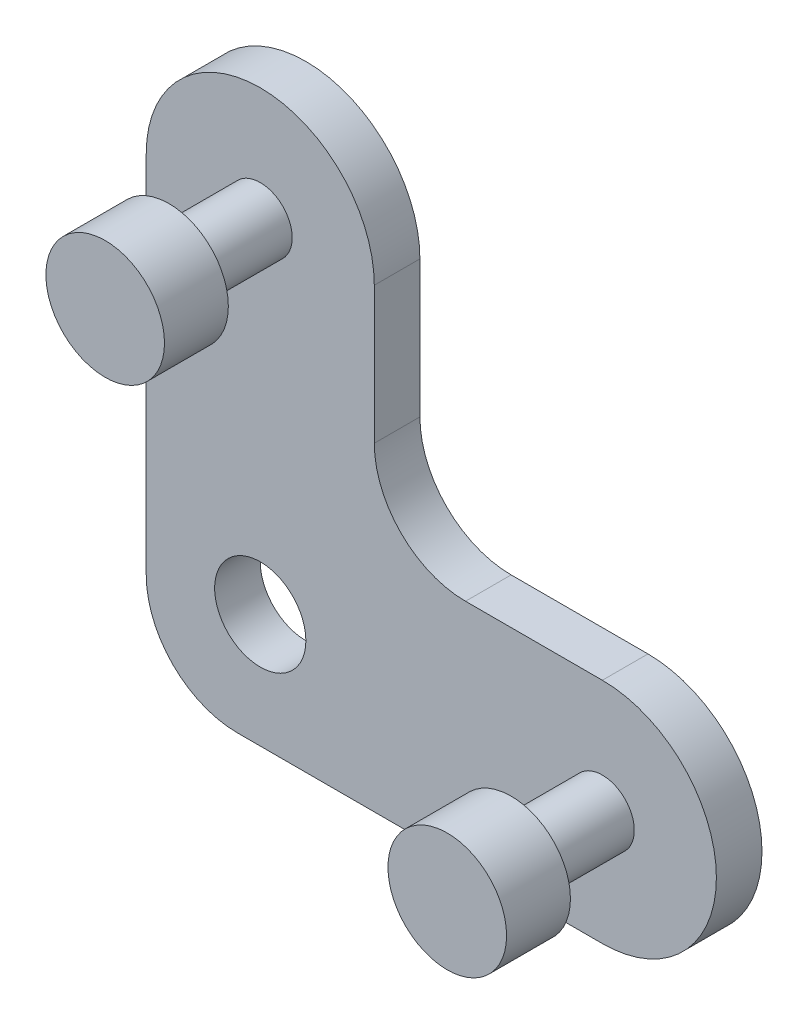
ISO-10303-21;
HEADER;
FILE_DESCRIPTION(('STEP AP214'),'2;1');
FILE_NAME('part.step','',(''),(''),'','','');
FILE_SCHEMA(('AUTOMOTIVE_DESIGN { 1 0 10303 214 1 1 1 1 }'));
ENDSEC;
DATA;
#1=APPLICATION_CONTEXT('core data for automotive mechanical design processes');
#2=APPLICATION_PROTOCOL_DEFINITION('international standard','automotive_design',2000,#1);
#3=PRODUCT_CONTEXT('',#1,'mechanical');
#4=PRODUCT('Part','Part','',(#3));
#5=PRODUCT_RELATED_PRODUCT_CATEGORY('part','',(#4));
#6=PRODUCT_DEFINITION_FORMATION('','',#4);
#7=PRODUCT_DEFINITION_CONTEXT('part definition',#1,'design');
#8=PRODUCT_DEFINITION('design','',#6,#7);
#9=PRODUCT_DEFINITION_SHAPE('','',#8);
#10=(LENGTH_UNIT() NAMED_UNIT(*) SI_UNIT(.MILLI.,.METRE.));
#11=(NAMED_UNIT(*) PLANE_ANGLE_UNIT() SI_UNIT($,.RADIAN.));
#12=(NAMED_UNIT(*) SI_UNIT($,.STERADIAN.) SOLID_ANGLE_UNIT());
#13=UNCERTAINTY_MEASURE_WITH_UNIT(LENGTH_MEASURE(1.E-05),#10,'distance_accuracy_value','');
#14=(GEOMETRIC_REPRESENTATION_CONTEXT(3) GLOBAL_UNCERTAINTY_ASSIGNED_CONTEXT((#13)) GLOBAL_UNIT_ASSIGNED_CONTEXT((#10,
#11,#12)) REPRESENTATION_CONTEXT('',''));
#15=CARTESIAN_POINT('',(0.,0.,0.));
#16=DIRECTION('',(0.,0.,1.));
#17=DIRECTION('',(1.,0.,0.));
#18=AXIS2_PLACEMENT_3D('',#15,#16,#17);
#19=CARTESIAN_POINT('',(3.175,12.7,1.27));
#20=DIRECTION('',(0.,0.,-1.));
#21=DIRECTION('',(-1.,0.,0.));
#22=AXIS2_PLACEMENT_3D('',#19,#20,#21);
#23=PLANE('',#22);
#24=CARTESIAN_POINT('',(3.17499999999941,3.17499999999941,1.27));
#25=DIRECTION('',(0.,0.,1.));
#26=DIRECTION('',(1.,0.,0.));
#27=AXIS2_PLACEMENT_3D('',#24,#25,#26);
#28=CIRCLE('',#27,1.27);
#29=CARTESIAN_POINT('',(4.44499999999941,3.17499999999941,1.27));
#30=VERTEX_POINT('',#29);
#31=EDGE_CURVE('E234',#30,#30,#28,.T.);
#32=ORIENTED_EDGE('',*,*,#31,.F.);
#33=EDGE_LOOP('',(#32));
#34=FACE_BOUND('',#33,.T.);
#35=CARTESIAN_POINT('',(3.175,12.7,1.27));
#36=DIRECTION('',(0.,0.,-1.));
#37=DIRECTION('',(-1.,0.,0.));
#38=AXIS2_PLACEMENT_3D('',#35,#36,#37);
#39=CIRCLE('',#38,0.888999999999999);
#40=CARTESIAN_POINT('',(2.286,12.7,1.27));
#41=VERTEX_POINT('',#40);
#42=EDGE_CURVE('E42',#41,#41,#39,.F.);
#43=ORIENTED_EDGE('',*,*,#42,.F.);
#44=EDGE_LOOP('',(#43));
#45=FACE_BOUND('',#44,.T.);
#46=CARTESIAN_POINT('',(3.175,12.7,1.27));
#47=DIRECTION('',(0.,0.,1.));
#48=DIRECTION('',(-1.,0.,0.));
#49=AXIS2_PLACEMENT_3D('',#46,#47,#48);
#50=CIRCLE('',#49,3.175);
#51=CARTESIAN_POINT('',(6.35,12.7,1.27));
#52=VERTEX_POINT('',#51);
#53=CARTESIAN_POINT('',(0.,12.7,1.27));
#54=VERTEX_POINT('',#53);
#55=EDGE_CURVE('E146',#52,#54,#50,.T.);
#56=ORIENTED_EDGE('',*,*,#55,.T.);
#57=DIRECTION('',(0.,-1.,0.));
#58=VECTOR('',#57,1.);
#59=CARTESIAN_POINT('',(0.,12.7,1.27));
#60=LINE('',#59,#58);
#61=CARTESIAN_POINT('',(0.,2.54000000000002,1.27));
#62=VERTEX_POINT('',#61);
#63=EDGE_CURVE('E94',#54,#62,#60,.T.);
#64=ORIENTED_EDGE('',*,*,#63,.T.);
#65=CARTESIAN_POINT('',(2.54,2.54,1.27));
#66=DIRECTION('',(0.,0.,1.));
#67=DIRECTION('',(1.,0.,0.));
#68=AXIS2_PLACEMENT_3D('',#65,#66,#67);
#69=CIRCLE('',#68,2.54);
#70=CARTESIAN_POINT('',(2.54000000000002,0.,1.27));
#71=VERTEX_POINT('',#70);
#72=EDGE_CURVE('E208',#62,#71,#69,.T.);
#73=ORIENTED_EDGE('',*,*,#72,.T.);
#74=DIRECTION('',(1.,0.,0.));
#75=VECTOR('',#74,1.);
#76=CARTESIAN_POINT('',(2.54000000000002,0.,1.27));
#77=LINE('',#76,#75);
#78=CARTESIAN_POINT('',(12.7,0.,1.27));
#79=VERTEX_POINT('',#78);
#80=EDGE_CURVE('E213',#71,#79,#77,.T.);
#81=ORIENTED_EDGE('',*,*,#80,.T.);
#82=CARTESIAN_POINT('',(12.7,3.175,1.27));
#83=DIRECTION('',(0.,0.,1.));
#84=DIRECTION('',(1.,0.,0.));
#85=AXIS2_PLACEMENT_3D('',#82,#83,#84);
#86=CIRCLE('',#85,3.175);
#87=CARTESIAN_POINT('',(12.7,6.35,1.27));
#88=VERTEX_POINT('',#87);
#89=EDGE_CURVE('E113',#79,#88,#86,.T.);
#90=ORIENTED_EDGE('',*,*,#89,.T.);
#91=DIRECTION('',(-1.,0.,0.));
#92=VECTOR('',#91,1.);
#93=CARTESIAN_POINT('',(8.89000000000002,6.35,1.27));
#94=LINE('',#93,#92);
#95=CARTESIAN_POINT('',(8.89000000000002,6.35,1.27));
#96=VERTEX_POINT('',#95);
#97=EDGE_CURVE('E107',#88,#96,#94,.T.);
#98=ORIENTED_EDGE('',*,*,#97,.T.);
#99=CARTESIAN_POINT('',(8.89,8.89,1.27));
#100=DIRECTION('',(0.,0.,-1.));
#101=DIRECTION('',(1.,0.,0.));
#102=AXIS2_PLACEMENT_3D('',#99,#100,#101);
#103=CIRCLE('',#102,2.54);
#104=CARTESIAN_POINT('',(6.35,8.89000000000002,1.27));
#105=VERTEX_POINT('',#104);
#106=EDGE_CURVE('E111',#96,#105,#103,.T.);
#107=ORIENTED_EDGE('',*,*,#106,.T.);
#108=DIRECTION('',(0.,1.,0.));
#109=VECTOR('',#108,1.);
#110=CARTESIAN_POINT('',(6.35,12.7,1.27));
#111=LINE('',#110,#109);
#112=EDGE_CURVE('E50',#105,#52,#111,.T.);
#113=ORIENTED_EDGE('',*,*,#112,.T.);
#114=EDGE_LOOP('',(#56,#64,#73,#81,#90,#98,#107,#113));
#115=FACE_BOUND('',#114,.T.);
#116=CARTESIAN_POINT('',(12.7,3.175,1.27));
#117=DIRECTION('',(0.,0.,-1.));
#118=DIRECTION('',(-1.,0.,0.));
#119=AXIS2_PLACEMENT_3D('',#116,#117,#118);
#120=CIRCLE('',#119,0.889000000000003);
#121=CARTESIAN_POINT('',(11.811,3.175,1.27));
#122=VERTEX_POINT('',#121);
#123=EDGE_CURVE('E11',#122,#122,#120,.F.);
#124=ORIENTED_EDGE('',*,*,#123,.F.);
#125=EDGE_LOOP('',(#124));
#126=FACE_BOUND('',#125,.T.);
#127=ADVANCED_FACE('F33',(#34,#45,#115,#126),#23,.F.);
#128=CARTESIAN_POINT('',(3.175,12.7,1.27));
#129=DIRECTION('',(0.,0.,-1.));
#130=DIRECTION('',(-1.,0.,0.));
#131=AXIS2_PLACEMENT_3D('',#128,#129,#130);
#132=CYLINDRICAL_SURFACE('',#131,3.175);
#133=CARTESIAN_POINT('',(3.175,12.7,0.));
#134=DIRECTION('',(0.,0.,1.));
#135=DIRECTION('',(-1.,0.,0.));
#136=AXIS2_PLACEMENT_3D('',#133,#134,#135);
#137=CIRCLE('',#136,3.175);
#138=CARTESIAN_POINT('',(6.35,12.7,0.));
#139=VERTEX_POINT('',#138);
#140=CARTESIAN_POINT('',(0.,12.7,0.));
#141=VERTEX_POINT('',#140);
#142=EDGE_CURVE('E131',#139,#141,#137,.T.);
#143=ORIENTED_EDGE('',*,*,#142,.T.);
#144=DIRECTION('',(0.,0.,-1.));
#145=VECTOR('',#144,1.);
#146=CARTESIAN_POINT('',(0.,12.7,1.27));
#147=LINE('',#146,#145);
#148=EDGE_CURVE('E159',#54,#141,#147,.T.);
#149=ORIENTED_EDGE('',*,*,#148,.F.);
#150=ORIENTED_EDGE('',*,*,#55,.F.);
#151=DIRECTION('',(0.,0.,-1.));
#152=VECTOR('',#151,1.);
#153=CARTESIAN_POINT('',(6.35,12.7,1.27));
#154=LINE('',#153,#152);
#155=EDGE_CURVE('E127',#52,#139,#154,.T.);
#156=ORIENTED_EDGE('',*,*,#155,.T.);
#157=EDGE_LOOP('',(#143,#149,#150,#156));
#158=FACE_BOUND('',#157,.T.);
#159=ADVANCED_FACE('F35',(#158),#132,.T.);
#160=CARTESIAN_POINT('',(0.,12.7,1.27));
#161=DIRECTION('',(1.,0.,0.));
#162=DIRECTION('',(0.,1.,0.));
#163=AXIS2_PLACEMENT_3D('',#160,#161,#162);
#164=PLANE('',#163);
#165=DIRECTION('',(0.,-1.,0.));
#166=VECTOR('',#165,1.);
#167=CARTESIAN_POINT('',(0.,12.7,0.));
#168=LINE('',#167,#166);
#169=CARTESIAN_POINT('',(0.,2.54000000000002,0.));
#170=VERTEX_POINT('',#169);
#171=EDGE_CURVE('E134',#141,#170,#168,.T.);
#172=ORIENTED_EDGE('',*,*,#171,.T.);
#173=DIRECTION('',(0.,0.,-1.));
#174=VECTOR('',#173,1.);
#175=CARTESIAN_POINT('',(0.,2.54000000000002,1.27));
#176=LINE('',#175,#174);
#177=EDGE_CURVE('E156',#62,#170,#176,.T.);
#178=ORIENTED_EDGE('',*,*,#177,.F.);
#179=ORIENTED_EDGE('',*,*,#63,.F.);
#180=ORIENTED_EDGE('',*,*,#148,.T.);
#181=EDGE_LOOP('',(#172,#178,#179,#180));
#182=FACE_BOUND('',#181,.T.);
#183=ADVANCED_FACE('F171',(#182),#164,.F.);
#184=CARTESIAN_POINT('',(2.54,2.54,1.27));
#185=DIRECTION('',(0.,0.,-1.));
#186=DIRECTION('',(-1.,0.,0.));
#187=AXIS2_PLACEMENT_3D('',#184,#185,#186);
#188=CYLINDRICAL_SURFACE('',#187,2.54);
#189=CARTESIAN_POINT('',(2.54,2.54,0.));
#190=DIRECTION('',(0.,0.,1.));
#191=DIRECTION('',(1.,0.,0.));
#192=AXIS2_PLACEMENT_3D('',#189,#190,#191);
#193=CIRCLE('',#192,2.54);
#194=CARTESIAN_POINT('',(2.54000000000002,0.,0.));
#195=VERTEX_POINT('',#194);
#196=EDGE_CURVE('E137',#170,#195,#193,.T.);
#197=ORIENTED_EDGE('',*,*,#196,.T.);
#198=DIRECTION('',(0.,0.,-1.));
#199=VECTOR('',#198,1.);
#200=CARTESIAN_POINT('',(2.54000000000002,0.,1.27));
#201=LINE('',#200,#199);
#202=EDGE_CURVE('E153',#71,#195,#201,.T.);
#203=ORIENTED_EDGE('',*,*,#202,.F.);
#204=ORIENTED_EDGE('',*,*,#72,.F.);
#205=ORIENTED_EDGE('',*,*,#177,.T.);
#206=EDGE_LOOP('',(#197,#203,#204,#205));
#207=FACE_BOUND('',#206,.T.);
#208=ADVANCED_FACE('F195',(#207),#188,.T.);
#209=CARTESIAN_POINT('',(2.54000000000002,0.,1.27));
#210=DIRECTION('',(0.,1.,0.));
#211=DIRECTION('',(0.,0.,1.));
#212=AXIS2_PLACEMENT_3D('',#209,#210,#211);
#213=PLANE('',#212);
#214=DIRECTION('',(1.,0.,0.));
#215=VECTOR('',#214,1.);
#216=CARTESIAN_POINT('',(2.54000000000002,0.,0.));
#217=LINE('',#216,#215);
#218=CARTESIAN_POINT('',(12.7,0.,0.));
#219=VERTEX_POINT('',#218);
#220=EDGE_CURVE('E139',#195,#219,#217,.T.);
#221=ORIENTED_EDGE('',*,*,#220,.T.);
#222=DIRECTION('',(0.,0.,-1.));
#223=VECTOR('',#222,1.);
#224=CARTESIAN_POINT('',(12.7,0.,1.27));
#225=LINE('',#224,#223);
#226=EDGE_CURVE('E150',#79,#219,#225,.T.);
#227=ORIENTED_EDGE('',*,*,#226,.F.);
#228=ORIENTED_EDGE('',*,*,#80,.F.);
#229=ORIENTED_EDGE('',*,*,#202,.T.);
#230=EDGE_LOOP('',(#221,#227,#228,#229));
#231=FACE_BOUND('',#230,.T.);
#232=ADVANCED_FACE('F191',(#231),#213,.F.);
#233=CARTESIAN_POINT('',(12.7,3.175,1.27));
#234=DIRECTION('',(0.,0.,-1.));
#235=DIRECTION('',(-1.,0.,0.));
#236=AXIS2_PLACEMENT_3D('',#233,#234,#235);
#237=CYLINDRICAL_SURFACE('',#236,3.175);
#238=CARTESIAN_POINT('',(12.7,3.175,0.));
#239=DIRECTION('',(0.,0.,1.));
#240=DIRECTION('',(1.,0.,0.));
#241=AXIS2_PLACEMENT_3D('',#238,#239,#240);
#242=CIRCLE('',#241,3.175);
#243=CARTESIAN_POINT('',(12.7,6.35,0.));
#244=VERTEX_POINT('',#243);
#245=EDGE_CURVE('E141',#219,#244,#242,.T.);
#246=ORIENTED_EDGE('',*,*,#245,.T.);
#247=DIRECTION('',(0.,0.,-1.));
#248=VECTOR('',#247,1.);
#249=CARTESIAN_POINT('',(12.7,6.35,1.27));
#250=LINE('',#249,#248);
#251=EDGE_CURVE('E122',#88,#244,#250,.T.);
#252=ORIENTED_EDGE('',*,*,#251,.F.);
#253=ORIENTED_EDGE('',*,*,#89,.F.);
#254=ORIENTED_EDGE('',*,*,#226,.T.);
#255=EDGE_LOOP('',(#246,#252,#253,#254));
#256=FACE_BOUND('',#255,.T.);
#257=ADVANCED_FACE('F188',(#256),#237,.T.);
#258=CARTESIAN_POINT('',(8.89000000000002,6.35,1.27));
#259=DIRECTION('',(0.,-1.,0.));
#260=DIRECTION('',(0.,0.,-1.));
#261=AXIS2_PLACEMENT_3D('',#258,#259,#260);
#262=PLANE('',#261);
#263=DIRECTION('',(-1.,0.,0.));
#264=VECTOR('',#263,1.);
#265=CARTESIAN_POINT('',(8.89000000000002,6.35,0.));
#266=LINE('',#265,#264);
#267=CARTESIAN_POINT('',(8.89000000000002,6.35,0.));
#268=VERTEX_POINT('',#267);
#269=EDGE_CURVE('E121',#244,#268,#266,.T.);
#270=ORIENTED_EDGE('',*,*,#269,.T.);
#271=DIRECTION('',(0.,0.,-1.));
#272=VECTOR('',#271,1.);
#273=CARTESIAN_POINT('',(8.89000000000002,6.35,1.27));
#274=LINE('',#273,#272);
#275=EDGE_CURVE('E118',#96,#268,#274,.T.);
#276=ORIENTED_EDGE('',*,*,#275,.F.);
#277=ORIENTED_EDGE('',*,*,#97,.F.);
#278=ORIENTED_EDGE('',*,*,#251,.T.);
#279=EDGE_LOOP('',(#270,#276,#277,#278));
#280=FACE_BOUND('',#279,.T.);
#281=ADVANCED_FACE('F119',(#280),#262,.F.);
#282=CARTESIAN_POINT('',(8.89,8.89,1.27));
#283=DIRECTION('',(0.,0.,-1.));
#284=DIRECTION('',(-1.,0.,0.));
#285=AXIS2_PLACEMENT_3D('',#282,#283,#284);
#286=CYLINDRICAL_SURFACE('',#285,2.54);
#287=CARTESIAN_POINT('',(8.89,8.89,0.));
#288=DIRECTION('',(0.,0.,-1.));
#289=DIRECTION('',(1.,0.,0.));
#290=AXIS2_PLACEMENT_3D('',#287,#288,#289);
#291=CIRCLE('',#290,2.54);
#292=CARTESIAN_POINT('',(6.35,8.89000000000002,0.));
#293=VERTEX_POINT('',#292);
#294=EDGE_CURVE('E79',#268,#293,#291,.T.);
#295=ORIENTED_EDGE('',*,*,#294,.T.);
#296=DIRECTION('',(0.,0.,-1.));
#297=VECTOR('',#296,1.);
#298=CARTESIAN_POINT('',(6.35,8.89000000000002,1.27));
#299=LINE('',#298,#297);
#300=EDGE_CURVE('E123',#105,#293,#299,.T.);
#301=ORIENTED_EDGE('',*,*,#300,.F.);
#302=ORIENTED_EDGE('',*,*,#106,.F.);
#303=ORIENTED_EDGE('',*,*,#275,.T.);
#304=EDGE_LOOP('',(#295,#301,#302,#303));
#305=FACE_BOUND('',#304,.T.);
#306=ADVANCED_FACE('F125',(#305),#286,.F.);
#307=CARTESIAN_POINT('',(6.35,12.7,1.27));
#308=DIRECTION('',(-1.,0.,0.));
#309=DIRECTION('',(0.,0.,1.));
#310=AXIS2_PLACEMENT_3D('',#307,#308,#309);
#311=PLANE('',#310);
#312=DIRECTION('',(0.,1.,0.));
#313=VECTOR('',#312,1.);
#314=CARTESIAN_POINT('',(6.35,12.7,0.));
#315=LINE('',#314,#313);
#316=EDGE_CURVE('E85',#293,#139,#315,.T.);
#317=ORIENTED_EDGE('',*,*,#316,.T.);
#318=ORIENTED_EDGE('',*,*,#155,.F.);
#319=ORIENTED_EDGE('',*,*,#112,.F.);
#320=ORIENTED_EDGE('',*,*,#300,.T.);
#321=EDGE_LOOP('',(#317,#318,#319,#320));
#322=FACE_BOUND('',#321,.T.);
#323=ADVANCED_FACE('F180',(#322),#311,.F.);
#324=CARTESIAN_POINT('',(3.175,12.7,0.));
#325=DIRECTION('',(0.,0.,-1.));
#326=DIRECTION('',(-1.,0.,0.));
#327=AXIS2_PLACEMENT_3D('',#324,#325,#326);
#328=PLANE('',#327);
#329=CARTESIAN_POINT('',(3.17499999999941,3.17499999999941,0.));
#330=DIRECTION('',(0.,0.,-1.));
#331=DIRECTION('',(-1.,0.,0.));
#332=AXIS2_PLACEMENT_3D('',#329,#330,#331);
#333=CIRCLE('',#332,1.27);
#334=CARTESIAN_POINT('',(1.90499999999941,3.17499999999941,0.));
#335=VERTEX_POINT('',#334);
#336=EDGE_CURVE('E237',#335,#335,#333,.F.);
#337=ORIENTED_EDGE('',*,*,#336,.T.);
#338=EDGE_LOOP('',(#337));
#339=FACE_BOUND('',#338,.T.);
#340=ORIENTED_EDGE('',*,*,#142,.F.);
#341=ORIENTED_EDGE('',*,*,#316,.F.);
#342=ORIENTED_EDGE('',*,*,#294,.F.);
#343=ORIENTED_EDGE('',*,*,#269,.F.);
#344=ORIENTED_EDGE('',*,*,#245,.F.);
#345=ORIENTED_EDGE('',*,*,#220,.F.);
#346=ORIENTED_EDGE('',*,*,#196,.F.);
#347=ORIENTED_EDGE('',*,*,#171,.F.);
#348=EDGE_LOOP('',(#340,#341,#342,#343,#344,#345,#346,#347));
#349=FACE_BOUND('',#348,.T.);
#350=ADVANCED_FACE('F177',(#339,#349),#328,.T.);
#351=CARTESIAN_POINT('',(3.175,12.7,3.81));
#352=DIRECTION('',(0.,0.,-1.));
#353=DIRECTION('',(-1.,0.,0.));
#354=AXIS2_PLACEMENT_3D('',#351,#352,#353);
#355=CYLINDRICAL_SURFACE('',#354,0.888999999999999);
#356=CARTESIAN_POINT('',(3.175,12.7,3.81));
#357=DIRECTION('',(0.,0.,1.));
#358=DIRECTION('',(1.,0.,0.));
#359=AXIS2_PLACEMENT_3D('',#356,#357,#358);
#360=CIRCLE('',#359,0.888999999999999);
#361=CARTESIAN_POINT('',(4.064,12.7,3.81));
#362=VERTEX_POINT('',#361);
#363=EDGE_CURVE('E135',#362,#362,#360,.T.);
#364=ORIENTED_EDGE('',*,*,#363,.F.);
#365=EDGE_LOOP('',(#364));
#366=FACE_BOUND('',#365,.T.);
#367=ORIENTED_EDGE('',*,*,#42,.T.);
#368=EDGE_LOOP('',(#367));
#369=FACE_BOUND('',#368,.T.);
#370=ADVANCED_FACE('F163',(#366,#369),#355,.T.);
#371=CARTESIAN_POINT('',(12.7,3.175,3.81));
#372=DIRECTION('',(0.,0.,-1.));
#373=DIRECTION('',(-1.,0.,0.));
#374=AXIS2_PLACEMENT_3D('',#371,#372,#373);
#375=CYLINDRICAL_SURFACE('',#374,0.889000000000003);
#376=CARTESIAN_POINT('',(12.7,3.175,3.81));
#377=DIRECTION('',(0.,0.,1.));
#378=DIRECTION('',(1.,0.,0.));
#379=AXIS2_PLACEMENT_3D('',#376,#377,#378);
#380=CIRCLE('',#379,0.889000000000003);
#381=CARTESIAN_POINT('',(13.589,3.175,3.81));
#382=VERTEX_POINT('',#381);
#383=EDGE_CURVE('E221',#382,#382,#380,.T.);
#384=ORIENTED_EDGE('',*,*,#383,.F.);
#385=EDGE_LOOP('',(#384));
#386=FACE_BOUND('',#385,.T.);
#387=ORIENTED_EDGE('',*,*,#123,.T.);
#388=EDGE_LOOP('',(#387));
#389=FACE_BOUND('',#388,.T.);
#390=ADVANCED_FACE('F270',(#386,#389),#375,.T.);
#391=CARTESIAN_POINT('',(12.7,3.175,3.81));
#392=DIRECTION('',(0.,0.,1.));
#393=DIRECTION('',(1.,0.,0.));
#394=AXIS2_PLACEMENT_3D('',#391,#392,#393);
#395=PLANE('',#394);
#396=CARTESIAN_POINT('',(12.7,3.175,3.81));
#397=DIRECTION('',(0.,0.,1.));
#398=DIRECTION('',(1.,0.,0.));
#399=AXIS2_PLACEMENT_3D('',#396,#397,#398);
#400=CIRCLE('',#399,1.651);
#401=CARTESIAN_POINT('',(14.351,3.175,3.81));
#402=VERTEX_POINT('',#401);
#403=EDGE_CURVE('E225',#402,#402,#400,.T.);
#404=ORIENTED_EDGE('',*,*,#403,.F.);
#405=EDGE_LOOP('',(#404));
#406=FACE_BOUND('',#405,.T.);
#407=ORIENTED_EDGE('',*,*,#383,.T.);
#408=EDGE_LOOP('',(#407));
#409=FACE_BOUND('',#408,.T.);
#410=ADVANCED_FACE('F267',(#406,#409),#395,.F.);
#411=CARTESIAN_POINT('',(12.7,3.175,5.588));
#412=DIRECTION('',(0.,0.,-1.));
#413=DIRECTION('',(-1.,0.,0.));
#414=AXIS2_PLACEMENT_3D('',#411,#412,#413);
#415=CYLINDRICAL_SURFACE('',#414,1.651);
#416=CARTESIAN_POINT('',(12.7,3.175,5.588));
#417=DIRECTION('',(0.,0.,1.));
#418=DIRECTION('',(1.,0.,0.));
#419=AXIS2_PLACEMENT_3D('',#416,#417,#418);
#420=CIRCLE('',#419,1.651);
#421=CARTESIAN_POINT('',(14.351,3.175,5.588));
#422=VERTEX_POINT('',#421);
#423=EDGE_CURVE('E224',#422,#422,#420,.T.);
#424=ORIENTED_EDGE('',*,*,#423,.F.);
#425=EDGE_LOOP('',(#424));
#426=FACE_BOUND('',#425,.T.);
#427=ORIENTED_EDGE('',*,*,#403,.T.);
#428=EDGE_LOOP('',(#427));
#429=FACE_BOUND('',#428,.T.);
#430=ADVANCED_FACE('F265',(#426,#429),#415,.T.);
#431=CARTESIAN_POINT('',(12.7,3.175,5.588));
#432=DIRECTION('',(0.,0.,1.));
#433=DIRECTION('',(1.,0.,0.));
#434=AXIS2_PLACEMENT_3D('',#431,#432,#433);
#435=PLANE('',#434);
#436=ORIENTED_EDGE('',*,*,#423,.T.);
#437=EDGE_LOOP('',(#436));
#438=FACE_BOUND('',#437,.T.);
#439=ADVANCED_FACE('F258',(#438),#435,.T.);
#440=CARTESIAN_POINT('',(3.175,12.7,3.81));
#441=DIRECTION('',(0.,0.,1.));
#442=DIRECTION('',(1.,0.,0.));
#443=AXIS2_PLACEMENT_3D('',#440,#441,#442);
#444=PLANE('',#443);
#445=CARTESIAN_POINT('',(3.175,12.7,3.81));
#446=DIRECTION('',(0.,0.,1.));
#447=DIRECTION('',(1.,0.,0.));
#448=AXIS2_PLACEMENT_3D('',#445,#446,#447);
#449=CIRCLE('',#448,1.651);
#450=CARTESIAN_POINT('',(4.826,12.7,3.81));
#451=VERTEX_POINT('',#450);
#452=EDGE_CURVE('E231',#451,#451,#449,.T.);
#453=ORIENTED_EDGE('',*,*,#452,.F.);
#454=EDGE_LOOP('',(#453));
#455=FACE_BOUND('',#454,.T.);
#456=ORIENTED_EDGE('',*,*,#363,.T.);
#457=EDGE_LOOP('',(#456));
#458=FACE_BOUND('',#457,.T.);
#459=ADVANCED_FACE('F255',(#455,#458),#444,.F.);
#460=CARTESIAN_POINT('',(3.175,12.7,5.588));
#461=DIRECTION('',(0.,0.,-1.));
#462=DIRECTION('',(-1.,0.,0.));
#463=AXIS2_PLACEMENT_3D('',#460,#461,#462);
#464=CYLINDRICAL_SURFACE('',#463,1.651);
#465=CARTESIAN_POINT('',(3.175,12.7,5.588));
#466=DIRECTION('',(0.,0.,1.));
#467=DIRECTION('',(1.,0.,0.));
#468=AXIS2_PLACEMENT_3D('',#465,#466,#467);
#469=CIRCLE('',#468,1.651);
#470=CARTESIAN_POINT('',(4.826,12.7,5.588));
#471=VERTEX_POINT('',#470);
#472=EDGE_CURVE('E228',#471,#471,#469,.T.);
#473=ORIENTED_EDGE('',*,*,#472,.F.);
#474=EDGE_LOOP('',(#473));
#475=FACE_BOUND('',#474,.T.);
#476=ORIENTED_EDGE('',*,*,#452,.T.);
#477=EDGE_LOOP('',(#476));
#478=FACE_BOUND('',#477,.T.);
#479=ADVANCED_FACE('F250',(#475,#478),#464,.T.);
#480=CARTESIAN_POINT('',(3.175,12.7,5.588));
#481=DIRECTION('',(0.,0.,1.));
#482=DIRECTION('',(1.,0.,0.));
#483=AXIS2_PLACEMENT_3D('',#480,#481,#482);
#484=PLANE('',#483);
#485=ORIENTED_EDGE('',*,*,#472,.T.);
#486=EDGE_LOOP('',(#485));
#487=FACE_BOUND('',#486,.T.);
#488=ADVANCED_FACE('F244',(#487),#484,.T.);
#489=CARTESIAN_POINT('',(3.17499999999941,3.17499999999941,-0.000999999999999916));
#490=DIRECTION('',(0.,0.,1.));
#491=DIRECTION('',(1.,0.,0.));
#492=AXIS2_PLACEMENT_3D('',#489,#490,#491);
#493=CYLINDRICAL_SURFACE('',#492,1.27);
#494=ORIENTED_EDGE('',*,*,#336,.F.);
#495=EDGE_LOOP('',(#494));
#496=FACE_BOUND('',#495,.T.);
#497=ORIENTED_EDGE('',*,*,#31,.T.);
#498=EDGE_LOOP('',(#497));
#499=FACE_BOUND('',#498,.T.);
#500=ADVANCED_FACE('F242',(#496,#499),#493,.F.);
#501=CLOSED_SHELL('',(#127,#159,#183,#208,#232,#257,#281,#306,#323,#350,#370,#390,#410,#430,
#439,#459,#479,#488,#500));
#502=MANIFOLD_SOLID_BREP('B2',#501);
#503=ADVANCED_BREP_SHAPE_REPRESENTATION('',(#18,#502),#14);
#504=SHAPE_DEFINITION_REPRESENTATION(#9,#503);
ENDSEC;
END-ISO-10303-21;
